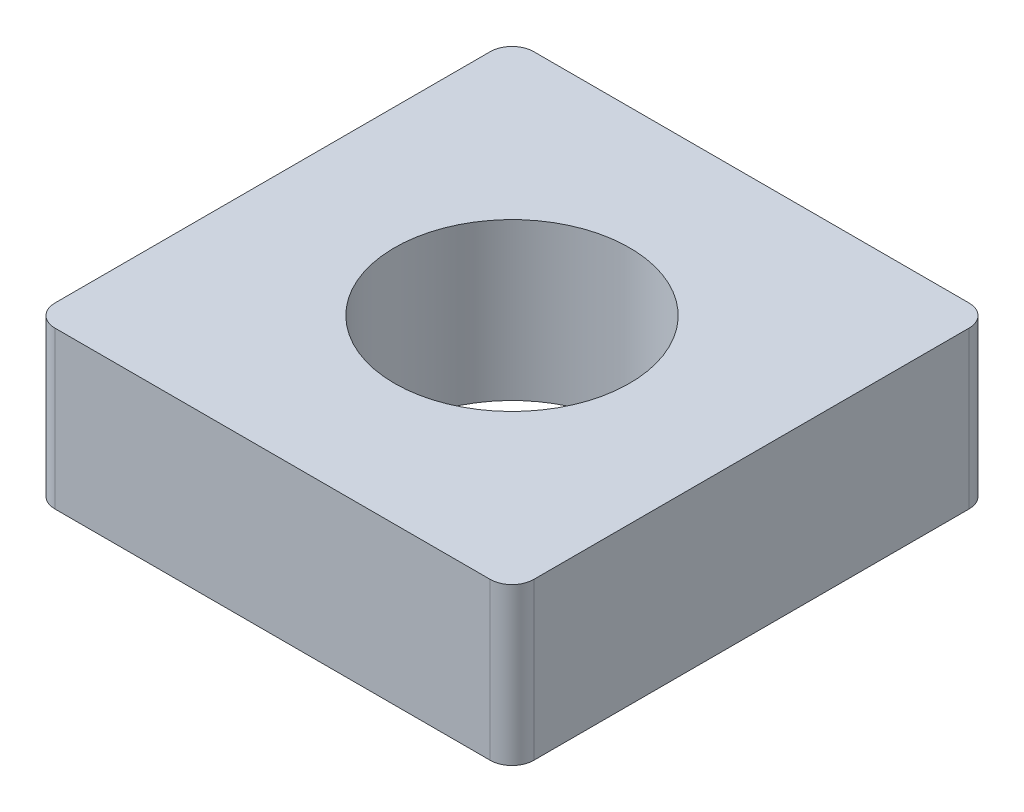
ISO-10303-21;
HEADER;
FILE_DESCRIPTION(('STEP AP214'),'2;1');
FILE_NAME('part.step','',(''),(''),'','','');
FILE_SCHEMA(('AUTOMOTIVE_DESIGN { 1 0 10303 214 1 1 1 1 }'));
ENDSEC;
DATA;
#1=APPLICATION_CONTEXT('core data for automotive mechanical design processes');
#2=APPLICATION_PROTOCOL_DEFINITION('international standard','automotive_design',2000,#1);
#3=PRODUCT_CONTEXT('',#1,'mechanical');
#4=PRODUCT('Part','Part','',(#3));
#5=PRODUCT_RELATED_PRODUCT_CATEGORY('part','',(#4));
#6=PRODUCT_DEFINITION_FORMATION('','',#4);
#7=PRODUCT_DEFINITION_CONTEXT('part definition',#1,'design');
#8=PRODUCT_DEFINITION('design','',#6,#7);
#9=PRODUCT_DEFINITION_SHAPE('','',#8);
#10=(LENGTH_UNIT() NAMED_UNIT(*) SI_UNIT(.MILLI.,.METRE.));
#11=(NAMED_UNIT(*) PLANE_ANGLE_UNIT() SI_UNIT($,.RADIAN.));
#12=(NAMED_UNIT(*) SI_UNIT($,.STERADIAN.) SOLID_ANGLE_UNIT());
#13=UNCERTAINTY_MEASURE_WITH_UNIT(LENGTH_MEASURE(1.E-05),#10,'distance_accuracy_value','');
#14=(GEOMETRIC_REPRESENTATION_CONTEXT(3) GLOBAL_UNCERTAINTY_ASSIGNED_CONTEXT((#13)) GLOBAL_UNIT_ASSIGNED_CONTEXT((#10,
#11,#12)) REPRESENTATION_CONTEXT('',''));
#15=CARTESIAN_POINT('',(0.,0.,0.));
#16=DIRECTION('',(0.,0.,1.));
#17=DIRECTION('',(1.,0.,0.));
#18=AXIS2_PLACEMENT_3D('',#15,#16,#17);
#19=CARTESIAN_POINT('',(0.,1.8,0.));
#20=DIRECTION('',(0.,1.,0.));
#21=DIRECTION('',(0.,0.,1.));
#22=AXIS2_PLACEMENT_3D('',#19,#20,#21);
#23=PLANE('',#22);
#24=DIRECTION('',(-1.,0.,0.));
#25=VECTOR('',#24,1.);
#26=CARTESIAN_POINT('',(2.75,1.8,-2.75));
#27=LINE('',#26,#25);
#28=CARTESIAN_POINT('',(2.5,1.8,-2.75));
#29=VERTEX_POINT('',#28);
#30=CARTESIAN_POINT('',(-2.5,1.8,-2.75));
#31=VERTEX_POINT('',#30);
#32=EDGE_CURVE('E146',#29,#31,#27,.T.);
#33=ORIENTED_EDGE('',*,*,#32,.T.);
#34=CARTESIAN_POINT('',(-2.5,1.8,-2.5));
#35=DIRECTION('',(0.,1.,0.));
#36=DIRECTION('',(0.,0.,1.));
#37=AXIS2_PLACEMENT_3D('',#34,#35,#36);
#38=CIRCLE('',#37,0.25);
#39=CARTESIAN_POINT('',(-2.75,1.8,-2.5));
#40=VERTEX_POINT('',#39);
#41=EDGE_CURVE('E164',#31,#40,#38,.T.);
#42=ORIENTED_EDGE('',*,*,#41,.T.);
#43=DIRECTION('',(0.,0.,1.));
#44=VECTOR('',#43,1.);
#45=CARTESIAN_POINT('',(-2.75,1.8,2.75));
#46=LINE('',#45,#44);
#47=CARTESIAN_POINT('',(-2.75,1.8,2.5));
#48=VERTEX_POINT('',#47);
#49=EDGE_CURVE('E128',#40,#48,#46,.T.);
#50=ORIENTED_EDGE('',*,*,#49,.T.);
#51=CARTESIAN_POINT('',(-2.5,1.8,2.5));
#52=DIRECTION('',(0.,1.,0.));
#53=DIRECTION('',(0.,0.,1.));
#54=AXIS2_PLACEMENT_3D('',#51,#52,#53);
#55=CIRCLE('',#54,0.25);
#56=CARTESIAN_POINT('',(-2.5,1.8,2.75));
#57=VERTEX_POINT('',#56);
#58=EDGE_CURVE('E160',#48,#57,#55,.T.);
#59=ORIENTED_EDGE('',*,*,#58,.T.);
#60=DIRECTION('',(1.,0.,0.));
#61=VECTOR('',#60,1.);
#62=CARTESIAN_POINT('',(2.75,1.8,2.75));
#63=LINE('',#62,#61);
#64=CARTESIAN_POINT('',(2.5,1.8,2.75));
#65=VERTEX_POINT('',#64);
#66=EDGE_CURVE('E173',#57,#65,#63,.T.);
#67=ORIENTED_EDGE('',*,*,#66,.T.);
#68=CARTESIAN_POINT('',(2.5,1.8,2.5));
#69=DIRECTION('',(0.,1.,0.));
#70=DIRECTION('',(0.,0.,1.));
#71=AXIS2_PLACEMENT_3D('',#68,#69,#70);
#72=CIRCLE('',#71,0.25);
#73=CARTESIAN_POINT('',(2.75,1.8,2.5));
#74=VERTEX_POINT('',#73);
#75=EDGE_CURVE('E63',#65,#74,#72,.T.);
#76=ORIENTED_EDGE('',*,*,#75,.T.);
#77=DIRECTION('',(0.,0.,-1.));
#78=VECTOR('',#77,1.);
#79=CARTESIAN_POINT('',(2.75,1.8,2.75));
#80=LINE('',#79,#78);
#81=CARTESIAN_POINT('',(2.75,1.8,-2.5));
#82=VERTEX_POINT('',#81);
#83=EDGE_CURVE('E179',#74,#82,#80,.T.);
#84=ORIENTED_EDGE('',*,*,#83,.T.);
#85=CARTESIAN_POINT('',(2.5,1.8,-2.5));
#86=DIRECTION('',(0.,1.,0.));
#87=DIRECTION('',(0.,0.,1.));
#88=AXIS2_PLACEMENT_3D('',#85,#86,#87);
#89=CIRCLE('',#88,0.25);
#90=EDGE_CURVE('E162',#82,#29,#89,.T.);
#91=ORIENTED_EDGE('',*,*,#90,.T.);
#92=EDGE_LOOP('',(#33,#42,#50,#59,#67,#76,#84,#91));
#93=FACE_BOUND('',#92,.T.);
#94=CARTESIAN_POINT('',(0.,1.8,0.));
#95=DIRECTION('',(0.,1.,0.));
#96=DIRECTION('',(0.,0.,1.));
#97=AXIS2_PLACEMENT_3D('',#94,#95,#96);
#98=CIRCLE('',#97,1.35);
#99=CARTESIAN_POINT('',(0.,1.8,1.35));
#100=VERTEX_POINT('',#99);
#101=EDGE_CURVE('E137',#100,#100,#98,.T.);
#102=ORIENTED_EDGE('',*,*,#101,.F.);
#103=EDGE_LOOP('',(#102));
#104=FACE_BOUND('',#103,.T.);
#105=ADVANCED_FACE('F41',(#93,#104),#23,.T.);
#106=CARTESIAN_POINT('',(0.,0.,0.));
#107=DIRECTION('',(0.,1.,0.));
#108=DIRECTION('',(0.,0.,1.));
#109=AXIS2_PLACEMENT_3D('',#106,#107,#108);
#110=PLANE('',#109);
#111=DIRECTION('',(0.,0.,1.));
#112=VECTOR('',#111,1.);
#113=CARTESIAN_POINT('',(-2.75,0.,2.75));
#114=LINE('',#113,#112);
#115=CARTESIAN_POINT('',(-2.75,0.,-2.5));
#116=VERTEX_POINT('',#115);
#117=CARTESIAN_POINT('',(-2.75,0.,2.5));
#118=VERTEX_POINT('',#117);
#119=EDGE_CURVE('E125',#116,#118,#114,.T.);
#120=ORIENTED_EDGE('',*,*,#119,.F.);
#121=CARTESIAN_POINT('',(-2.5,0.,-2.5));
#122=DIRECTION('',(0.,1.,0.));
#123=DIRECTION('',(0.,0.,1.));
#124=AXIS2_PLACEMENT_3D('',#121,#122,#123);
#125=CIRCLE('',#124,0.25);
#126=CARTESIAN_POINT('',(-2.5,0.,-2.75));
#127=VERTEX_POINT('',#126);
#128=EDGE_CURVE('E108',#116,#127,#125,.F.);
#129=ORIENTED_EDGE('',*,*,#128,.T.);
#130=DIRECTION('',(-1.,0.,0.));
#131=VECTOR('',#130,1.);
#132=CARTESIAN_POINT('',(2.75,0.,-2.75));
#133=LINE('',#132,#131);
#134=CARTESIAN_POINT('',(2.5,0.,-2.75));
#135=VERTEX_POINT('',#134);
#136=EDGE_CURVE('E150',#135,#127,#133,.T.);
#137=ORIENTED_EDGE('',*,*,#136,.F.);
#138=CARTESIAN_POINT('',(2.5,0.,-2.5));
#139=DIRECTION('',(0.,1.,0.));
#140=DIRECTION('',(0.,0.,1.));
#141=AXIS2_PLACEMENT_3D('',#138,#139,#140);
#142=CIRCLE('',#141,0.25);
#143=CARTESIAN_POINT('',(2.75,0.,-2.5));
#144=VERTEX_POINT('',#143);
#145=EDGE_CURVE('E119',#135,#144,#142,.F.);
#146=ORIENTED_EDGE('',*,*,#145,.T.);
#147=DIRECTION('',(0.,0.,-1.));
#148=VECTOR('',#147,1.);
#149=CARTESIAN_POINT('',(2.75,0.,2.75));
#150=LINE('',#149,#148);
#151=CARTESIAN_POINT('',(2.75,0.,2.5));
#152=VERTEX_POINT('',#151);
#153=EDGE_CURVE('E140',#152,#144,#150,.T.);
#154=ORIENTED_EDGE('',*,*,#153,.F.);
#155=CARTESIAN_POINT('',(2.5,0.,2.5));
#156=DIRECTION('',(0.,1.,0.));
#157=DIRECTION('',(0.,0.,1.));
#158=AXIS2_PLACEMENT_3D('',#155,#156,#157);
#159=CIRCLE('',#158,0.25);
#160=CARTESIAN_POINT('',(2.5,0.,2.75));
#161=VERTEX_POINT('',#160);
#162=EDGE_CURVE('E129',#152,#161,#159,.F.);
#163=ORIENTED_EDGE('',*,*,#162,.T.);
#164=DIRECTION('',(1.,0.,0.));
#165=VECTOR('',#164,1.);
#166=CARTESIAN_POINT('',(2.75,0.,2.75));
#167=LINE('',#166,#165);
#168=CARTESIAN_POINT('',(-2.5,0.,2.75));
#169=VERTEX_POINT('',#168);
#170=EDGE_CURVE('E136',#169,#161,#167,.T.);
#171=ORIENTED_EDGE('',*,*,#170,.F.);
#172=CARTESIAN_POINT('',(-2.5,0.,2.5));
#173=DIRECTION('',(0.,1.,0.));
#174=DIRECTION('',(0.,0.,1.));
#175=AXIS2_PLACEMENT_3D('',#172,#173,#174);
#176=CIRCLE('',#175,0.25);
#177=EDGE_CURVE('E135',#169,#118,#176,.F.);
#178=ORIENTED_EDGE('',*,*,#177,.T.);
#179=EDGE_LOOP('',(#120,#129,#137,#146,#154,#163,#171,#178));
#180=FACE_BOUND('',#179,.T.);
#181=CARTESIAN_POINT('',(0.,0.,0.));
#182=DIRECTION('',(0.,1.,0.));
#183=DIRECTION('',(0.,0.,1.));
#184=AXIS2_PLACEMENT_3D('',#181,#182,#183);
#185=CIRCLE('',#184,1.35);
#186=CARTESIAN_POINT('',(0.,0.,1.35));
#187=VERTEX_POINT('',#186);
#188=EDGE_CURVE('E143',#187,#187,#185,.T.);
#189=ORIENTED_EDGE('',*,*,#188,.T.);
#190=EDGE_LOOP('',(#189));
#191=FACE_BOUND('',#190,.T.);
#192=ADVANCED_FACE('F132',(#180,#191),#110,.F.);
#193=CARTESIAN_POINT('',(-2.75,1.8,2.75));
#194=DIRECTION('',(1.,0.,0.));
#195=DIRECTION('',(0.,0.,-1.));
#196=AXIS2_PLACEMENT_3D('',#193,#194,#195);
#197=PLANE('',#196);
#198=ORIENTED_EDGE('',*,*,#49,.F.);
#199=DIRECTION('',(0.,-1.,0.));
#200=VECTOR('',#199,1.);
#201=CARTESIAN_POINT('',(-2.75,1.8,-2.5));
#202=LINE('',#201,#200);
#203=EDGE_CURVE('E112',#40,#116,#202,.T.);
#204=ORIENTED_EDGE('',*,*,#203,.T.);
#205=ORIENTED_EDGE('',*,*,#119,.T.);
#206=DIRECTION('',(0.,-1.,0.));
#207=VECTOR('',#206,1.);
#208=CARTESIAN_POINT('',(-2.75,1.8,2.5));
#209=LINE('',#208,#207);
#210=EDGE_CURVE('E130',#118,#48,#209,.F.);
#211=ORIENTED_EDGE('',*,*,#210,.T.);
#212=EDGE_LOOP('',(#198,#204,#205,#211));
#213=FACE_BOUND('',#212,.T.);
#214=ADVANCED_FACE('F124',(#213),#197,.F.);
#215=CARTESIAN_POINT('',(2.75,1.8,2.75));
#216=DIRECTION('',(0.,0.,-1.));
#217=DIRECTION('',(-1.,0.,0.));
#218=AXIS2_PLACEMENT_3D('',#215,#216,#217);
#219=PLANE('',#218);
#220=ORIENTED_EDGE('',*,*,#66,.F.);
#221=DIRECTION('',(0.,-1.,0.));
#222=VECTOR('',#221,1.);
#223=CARTESIAN_POINT('',(-2.5,1.8,2.75));
#224=LINE('',#223,#222);
#225=EDGE_CURVE('E11',#57,#169,#224,.T.);
#226=ORIENTED_EDGE('',*,*,#225,.T.);
#227=ORIENTED_EDGE('',*,*,#170,.T.);
#228=DIRECTION('',(0.,-1.,0.));
#229=VECTOR('',#228,1.);
#230=CARTESIAN_POINT('',(2.5,1.8,2.75));
#231=LINE('',#230,#229);
#232=EDGE_CURVE('E49',#161,#65,#231,.F.);
#233=ORIENTED_EDGE('',*,*,#232,.T.);
#234=EDGE_LOOP('',(#220,#226,#227,#233));
#235=FACE_BOUND('',#234,.T.);
#236=ADVANCED_FACE('F172',(#235),#219,.F.);
#237=CARTESIAN_POINT('',(2.75,1.8,2.75));
#238=DIRECTION('',(-1.,0.,0.));
#239=DIRECTION('',(0.,0.,1.));
#240=AXIS2_PLACEMENT_3D('',#237,#238,#239);
#241=PLANE('',#240);
#242=ORIENTED_EDGE('',*,*,#153,.T.);
#243=DIRECTION('',(0.,-1.,0.));
#244=VECTOR('',#243,1.);
#245=CARTESIAN_POINT('',(2.75,1.8,-2.5));
#246=LINE('',#245,#244);
#247=EDGE_CURVE('E56',#144,#82,#246,.F.);
#248=ORIENTED_EDGE('',*,*,#247,.T.);
#249=ORIENTED_EDGE('',*,*,#83,.F.);
#250=DIRECTION('',(0.,-1.,0.));
#251=VECTOR('',#250,1.);
#252=CARTESIAN_POINT('',(2.75,1.8,2.5));
#253=LINE('',#252,#251);
#254=EDGE_CURVE('E166',#74,#152,#253,.T.);
#255=ORIENTED_EDGE('',*,*,#254,.T.);
#256=EDGE_LOOP('',(#242,#248,#249,#255));
#257=FACE_BOUND('',#256,.T.);
#258=ADVANCED_FACE('F183',(#257),#241,.F.);
#259=CARTESIAN_POINT('',(2.75,1.8,-2.75));
#260=DIRECTION('',(0.,0.,1.));
#261=DIRECTION('',(1.,0.,0.));
#262=AXIS2_PLACEMENT_3D('',#259,#260,#261);
#263=PLANE('',#262);
#264=ORIENTED_EDGE('',*,*,#136,.T.);
#265=DIRECTION('',(0.,-1.,0.));
#266=VECTOR('',#265,1.);
#267=CARTESIAN_POINT('',(-2.5,1.8,-2.75));
#268=LINE('',#267,#266);
#269=EDGE_CURVE('E113',#127,#31,#268,.F.);
#270=ORIENTED_EDGE('',*,*,#269,.T.);
#271=ORIENTED_EDGE('',*,*,#32,.F.);
#272=DIRECTION('',(0.,-1.,0.));
#273=VECTOR('',#272,1.);
#274=CARTESIAN_POINT('',(2.5,1.8,-2.75));
#275=LINE('',#274,#273);
#276=EDGE_CURVE('E118',#29,#135,#275,.T.);
#277=ORIENTED_EDGE('',*,*,#276,.T.);
#278=EDGE_LOOP('',(#264,#270,#271,#277));
#279=FACE_BOUND('',#278,.T.);
#280=ADVANCED_FACE('F190',(#279),#263,.F.);
#281=CARTESIAN_POINT('',(0.,1.8,0.));
#282=DIRECTION('',(0.,-1.,0.));
#283=DIRECTION('',(0.,0.,-1.));
#284=AXIS2_PLACEMENT_3D('',#281,#282,#283);
#285=CYLINDRICAL_SURFACE('',#284,1.35);
#286=ORIENTED_EDGE('',*,*,#101,.T.);
#287=EDGE_LOOP('',(#286));
#288=FACE_BOUND('',#287,.T.);
#289=ORIENTED_EDGE('',*,*,#188,.F.);
#290=EDGE_LOOP('',(#289));
#291=FACE_BOUND('',#290,.T.);
#292=ADVANCED_FACE('F196',(#288,#291),#285,.F.);
#293=CARTESIAN_POINT('',(-2.5,1.8,-2.5));
#294=DIRECTION('',(0.,-1.,0.));
#295=DIRECTION('',(0.,0.,-1.));
#296=AXIS2_PLACEMENT_3D('',#293,#294,#295);
#297=CYLINDRICAL_SURFACE('',#296,0.25);
#298=ORIENTED_EDGE('',*,*,#41,.F.);
#299=ORIENTED_EDGE('',*,*,#269,.F.);
#300=ORIENTED_EDGE('',*,*,#128,.F.);
#301=ORIENTED_EDGE('',*,*,#203,.F.);
#302=EDGE_LOOP('',(#298,#299,#300,#301));
#303=FACE_BOUND('',#302,.T.);
#304=ADVANCED_FACE('F111',(#303),#297,.T.);
#305=CARTESIAN_POINT('',(2.5,1.8,-2.5));
#306=DIRECTION('',(0.,-1.,0.));
#307=DIRECTION('',(0.,0.,-1.));
#308=AXIS2_PLACEMENT_3D('',#305,#306,#307);
#309=CYLINDRICAL_SURFACE('',#308,0.25);
#310=ORIENTED_EDGE('',*,*,#90,.F.);
#311=ORIENTED_EDGE('',*,*,#247,.F.);
#312=ORIENTED_EDGE('',*,*,#145,.F.);
#313=ORIENTED_EDGE('',*,*,#276,.F.);
#314=EDGE_LOOP('',(#310,#311,#312,#313));
#315=FACE_BOUND('',#314,.T.);
#316=ADVANCED_FACE('F187',(#315),#309,.T.);
#317=CARTESIAN_POINT('',(-2.5,1.8,2.5));
#318=DIRECTION('',(0.,-1.,0.));
#319=DIRECTION('',(0.,0.,-1.));
#320=AXIS2_PLACEMENT_3D('',#317,#318,#319);
#321=CYLINDRICAL_SURFACE('',#320,0.25);
#322=ORIENTED_EDGE('',*,*,#58,.F.);
#323=ORIENTED_EDGE('',*,*,#210,.F.);
#324=ORIENTED_EDGE('',*,*,#177,.F.);
#325=ORIENTED_EDGE('',*,*,#225,.F.);
#326=EDGE_LOOP('',(#322,#323,#324,#325));
#327=FACE_BOUND('',#326,.T.);
#328=ADVANCED_FACE('F220',(#327),#321,.T.);
#329=CARTESIAN_POINT('',(2.5,1.8,2.5));
#330=DIRECTION('',(0.,-1.,0.));
#331=DIRECTION('',(0.,0.,-1.));
#332=AXIS2_PLACEMENT_3D('',#329,#330,#331);
#333=CYLINDRICAL_SURFACE('',#332,0.25);
#334=ORIENTED_EDGE('',*,*,#75,.F.);
#335=ORIENTED_EDGE('',*,*,#232,.F.);
#336=ORIENTED_EDGE('',*,*,#162,.F.);
#337=ORIENTED_EDGE('',*,*,#254,.F.);
#338=EDGE_LOOP('',(#334,#335,#336,#337));
#339=FACE_BOUND('',#338,.T.);
#340=ADVANCED_FACE('F43',(#339),#333,.T.);
#341=CLOSED_SHELL('',(#105,#192,#214,#236,#258,#280,#292,#304,#316,#328,#340));
#342=MANIFOLD_SOLID_BREP('B2',#341);
#343=ADVANCED_BREP_SHAPE_REPRESENTATION('',(#18,#342),#14);
#344=SHAPE_DEFINITION_REPRESENTATION(#9,#343);
ENDSEC;
END-ISO-10303-21;
